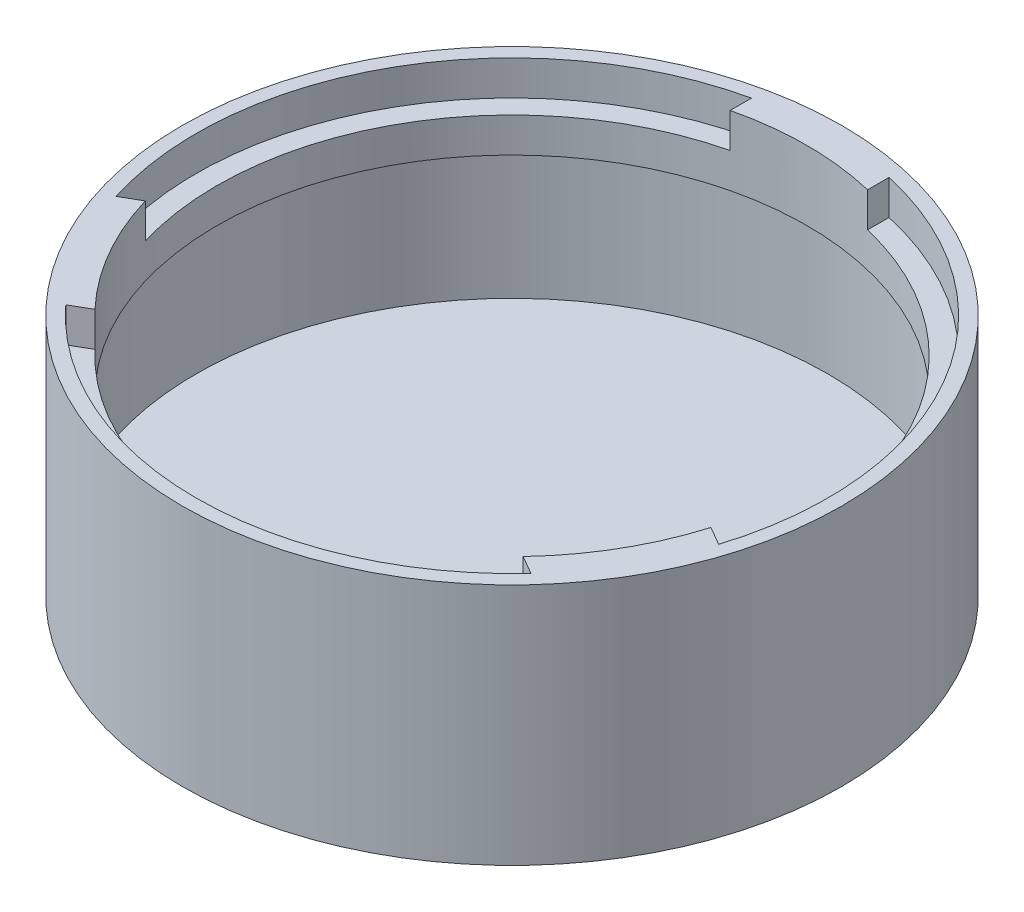
ISO-10303-21;
HEADER;
FILE_DESCRIPTION(('STEP AP214'),'2;1');
FILE_NAME('part.step','',(''),(''),'','','');
FILE_SCHEMA(('AUTOMOTIVE_DESIGN { 1 0 10303 214 1 1 1 1 }'));
ENDSEC;
DATA;
#1=APPLICATION_CONTEXT('core data for automotive mechanical design processes');
#2=APPLICATION_PROTOCOL_DEFINITION('international standard','automotive_design',2000,#1);
#3=PRODUCT_CONTEXT('',#1,'mechanical');
#4=PRODUCT('Part','Part','',(#3));
#5=PRODUCT_RELATED_PRODUCT_CATEGORY('part','',(#4));
#6=PRODUCT_DEFINITION_FORMATION('','',#4);
#7=PRODUCT_DEFINITION_CONTEXT('part definition',#1,'design');
#8=PRODUCT_DEFINITION('design','',#6,#7);
#9=PRODUCT_DEFINITION_SHAPE('','',#8);
#10=(LENGTH_UNIT() NAMED_UNIT(*) SI_UNIT(.MILLI.,.METRE.));
#11=(NAMED_UNIT(*) PLANE_ANGLE_UNIT() SI_UNIT($,.RADIAN.));
#12=(NAMED_UNIT(*) SI_UNIT($,.STERADIAN.) SOLID_ANGLE_UNIT());
#13=UNCERTAINTY_MEASURE_WITH_UNIT(LENGTH_MEASURE(1.E-05),#10,'distance_accuracy_value','');
#14=(GEOMETRIC_REPRESENTATION_CONTEXT(3) GLOBAL_UNCERTAINTY_ASSIGNED_CONTEXT((#13)) GLOBAL_UNIT_ASSIGNED_CONTEXT((#10,
#11,#12)) REPRESENTATION_CONTEXT('',''));
#15=CARTESIAN_POINT('',(0.,0.,0.));
#16=DIRECTION('',(0.,0.,1.));
#17=DIRECTION('',(1.,0.,0.));
#18=AXIS2_PLACEMENT_3D('',#15,#16,#17);
#19=CARTESIAN_POINT('',(0.,70.,0.));
#20=DIRECTION('',(0.,-1.,0.));
#21=DIRECTION('',(0.,0.,-1.));
#22=AXIS2_PLACEMENT_3D('',#19,#20,#21);
#23=CYLINDRICAL_SURFACE('',#22,91.);
#24=CARTESIAN_POINT('',(0.,60.,0.));
#25=DIRECTION('',(0.,1.,0.));
#26=DIRECTION('',(0.,0.,1.));
#27=AXIS2_PLACEMENT_3D('',#24,#25,#26);
#28=CIRCLE('',#27,91.);
#29=CARTESIAN_POINT('',(86.8202184084262,60.,27.2626058092982));
#30=VERTEX_POINT('',#29);
#31=CARTESIAN_POINT('',(19.8,60.,-88.8198176084594));
#32=VERTEX_POINT('',#31);
#33=EDGE_CURVE('E170',#30,#32,#28,.T.);
#34=ORIENTED_EDGE('',*,*,#33,.F.);
#35=DIRECTION('',(0.,-1.,0.));
#36=VECTOR('',#35,1.);
#37=CARTESIAN_POINT('',(86.8202184084262,70.,27.2626058092982));
#38=LINE('',#37,#36);
#39=CARTESIAN_POINT('',(86.8202184084262,70.,27.2626058092982));
#40=VERTEX_POINT('',#39);
#41=EDGE_CURVE('E200',#40,#30,#38,.T.);
#42=ORIENTED_EDGE('',*,*,#41,.F.);
#43=CARTESIAN_POINT('',(0.,70.,0.));
#44=DIRECTION('',(0.,1.,0.));
#45=DIRECTION('',(0.,0.,1.));
#46=AXIS2_PLACEMENT_3D('',#43,#44,#45);
#47=CIRCLE('',#46,91.);
#48=CARTESIAN_POINT('',(19.8,70.,-88.8198176084594));
#49=VERTEX_POINT('',#48);
#50=EDGE_CURVE('E232',#40,#49,#47,.T.);
#51=ORIENTED_EDGE('',*,*,#50,.T.);
#52=DIRECTION('',(0.,-1.,0.));
#53=VECTOR('',#52,1.);
#54=CARTESIAN_POINT('',(19.8,70.,-88.8198176084594));
#55=LINE('',#54,#53);
#56=EDGE_CURVE('E67',#49,#32,#55,.T.);
#57=ORIENTED_EDGE('',*,*,#56,.T.);
#58=EDGE_LOOP('',(#34,#42,#51,#57));
#59=FACE_BOUND('',#58,.T.);
#60=ADVANCED_FACE('F44',(#59),#23,.F.);
#61=CARTESIAN_POINT('',(-19.8,60.,-88.8198176084594));
#62=VERTEX_POINT('',#61);
#63=CARTESIAN_POINT('',(-86.8202184084262,60.,27.2626058092983));
#64=VERTEX_POINT('',#63);
#65=EDGE_CURVE('E59',#62,#64,#28,.T.);
#66=ORIENTED_EDGE('',*,*,#65,.F.);
#67=DIRECTION('',(0.,-1.,0.));
#68=VECTOR('',#67,1.);
#69=CARTESIAN_POINT('',(-19.8,70.,-88.8198176084594));
#70=LINE('',#69,#68);
#71=CARTESIAN_POINT('',(-19.8,70.,-88.8198176084594));
#72=VERTEX_POINT('',#71);
#73=EDGE_CURVE('E141',#72,#62,#70,.T.);
#74=ORIENTED_EDGE('',*,*,#73,.F.);
#75=CARTESIAN_POINT('',(-86.8202184084262,70.,27.2626058092983));
#76=VERTEX_POINT('',#75);
#77=EDGE_CURVE('E227',#72,#76,#47,.T.);
#78=ORIENTED_EDGE('',*,*,#77,.T.);
#79=DIRECTION('',(0.,-1.,0.));
#80=VECTOR('',#79,1.);
#81=CARTESIAN_POINT('',(-86.8202184084262,70.,27.2626058092983));
#82=LINE('',#81,#80);
#83=EDGE_CURVE('E225',#76,#64,#82,.T.);
#84=ORIENTED_EDGE('',*,*,#83,.T.);
#85=EDGE_LOOP('',(#66,#74,#78,#84));
#86=FACE_BOUND('',#85,.T.);
#87=ADVANCED_FACE('F252',(#86),#23,.F.);
#88=CARTESIAN_POINT('',(-67.020218408426,60.,61.557211799162));
#89=VERTEX_POINT('',#88);
#90=CARTESIAN_POINT('',(67.020218408426,60.,61.5572117991619));
#91=VERTEX_POINT('',#90);
#92=EDGE_CURVE('E171',#89,#91,#28,.T.);
#93=ORIENTED_EDGE('',*,*,#92,.F.);
#94=DIRECTION('',(0.,-1.,0.));
#95=VECTOR('',#94,1.);
#96=CARTESIAN_POINT('',(-67.020218408426,70.,61.557211799162));
#97=LINE('',#96,#95);
#98=CARTESIAN_POINT('',(-67.020218408426,70.,61.557211799162));
#99=VERTEX_POINT('',#98);
#100=EDGE_CURVE('E222',#99,#89,#97,.T.);
#101=ORIENTED_EDGE('',*,*,#100,.F.);
#102=CARTESIAN_POINT('',(67.020218408426,70.,61.5572117991619));
#103=VERTEX_POINT('',#102);
#104=EDGE_CURVE('E228',#99,#103,#47,.T.);
#105=ORIENTED_EDGE('',*,*,#104,.T.);
#106=DIRECTION('',(0.,-1.,0.));
#107=VECTOR('',#106,1.);
#108=CARTESIAN_POINT('',(67.020218408426,70.,61.5572117991619));
#109=LINE('',#108,#107);
#110=EDGE_CURVE('E203',#103,#91,#109,.T.);
#111=ORIENTED_EDGE('',*,*,#110,.T.);
#112=EDGE_LOOP('',(#93,#101,#105,#111));
#113=FACE_BOUND('',#112,.T.);
#114=ADVANCED_FACE('F249',(#113),#23,.F.);
#115=CARTESIAN_POINT('',(0.,10.,0.));
#116=DIRECTION('',(0.,-1.,0.));
#117=DIRECTION('',(0.,0.,-1.));
#118=AXIS2_PLACEMENT_3D('',#115,#116,#117);
#119=CYLINDRICAL_SURFACE('',#118,95.);
#120=CARTESIAN_POINT('',(0.,0.,0.));
#121=DIRECTION('',(0.,1.,0.));
#122=DIRECTION('',(0.,0.,1.));
#123=AXIS2_PLACEMENT_3D('',#120,#121,#122);
#124=CIRCLE('',#123,95.);
#125=CARTESIAN_POINT('',(0.,0.,95.));
#126=VERTEX_POINT('',#125);
#127=EDGE_CURVE('E52',#126,#126,#124,.T.);
#128=ORIENTED_EDGE('',*,*,#127,.T.);
#129=EDGE_LOOP('',(#128));
#130=FACE_BOUND('',#129,.T.);
#131=CARTESIAN_POINT('',(0.,70.,0.));
#132=DIRECTION('',(0.,1.,0.));
#133=DIRECTION('',(0.,0.,1.));
#134=AXIS2_PLACEMENT_3D('',#131,#132,#133);
#135=CIRCLE('',#134,95.);
#136=CARTESIAN_POINT('',(0.,70.,95.));
#137=VERTEX_POINT('',#136);
#138=EDGE_CURVE('E231',#137,#137,#135,.T.);
#139=ORIENTED_EDGE('',*,*,#138,.F.);
#140=EDGE_LOOP('',(#139));
#141=FACE_BOUND('',#140,.T.);
#142=ADVANCED_FACE('F46',(#130,#141),#119,.T.);
#143=CARTESIAN_POINT('',(0.,0.,0.));
#144=DIRECTION('',(0.,1.,0.));
#145=DIRECTION('',(0.,0.,1.));
#146=AXIS2_PLACEMENT_3D('',#143,#144,#145);
#147=PLANE('',#146);
#148=ORIENTED_EDGE('',*,*,#127,.F.);
#149=EDGE_LOOP('',(#148));
#150=FACE_BOUND('',#149,.T.);
#151=ADVANCED_FACE('F239',(#150),#147,.F.);
#152=CARTESIAN_POINT('',(0.,70.,0.));
#153=DIRECTION('',(0.,1.,0.));
#154=DIRECTION('',(0.,0.,1.));
#155=AXIS2_PLACEMENT_3D('',#152,#153,#154);
#156=PLANE('',#155);
#157=ORIENTED_EDGE('',*,*,#138,.T.);
#158=EDGE_LOOP('',(#157));
#159=FACE_BOUND('',#158,.T.);
#160=ORIENTED_EDGE('',*,*,#104,.F.);
#161=DIRECTION('',(0.866025403784436,0.,-0.500000000000005));
#162=VECTOR('',#161,1.);
#163=CARTESIAN_POINT('',(9.90000000000007,70.,17.1473029949318));
#164=LINE('',#163,#162);
#165=CARTESIAN_POINT('',(-61.6871496848419,70.,58.4781631359939));
#166=VERTEX_POINT('',#165);
#167=EDGE_CURVE('E209',#99,#166,#164,.T.);
#168=ORIENTED_EDGE('',*,*,#167,.T.);
#169=CARTESIAN_POINT('',(0.,70.,0.));
#170=DIRECTION('',(0.,1.,0.));
#171=DIRECTION('',(0.,0.,1.));
#172=AXIS2_PLACEMENT_3D('',#169,#170,#171);
#173=CIRCLE('',#172,85.);
#174=CARTESIAN_POINT('',(-81.4871496848421,70.,24.1835571461302));
#175=VERTEX_POINT('',#174);
#176=EDGE_CURVE('E212',#175,#166,#173,.T.);
#177=ORIENTED_EDGE('',*,*,#176,.F.);
#178=DIRECTION('',(0.866025403784436,0.,-0.500000000000004));
#179=VECTOR('',#178,1.);
#180=CARTESIAN_POINT('',(-9.90000000000007,70.,-17.1473029949318));
#181=LINE('',#180,#179);
#182=EDGE_CURVE('E206',#76,#175,#181,.T.);
#183=ORIENTED_EDGE('',*,*,#182,.F.);
#184=ORIENTED_EDGE('',*,*,#77,.F.);
#185=DIRECTION('',(0.,0.,1.));
#186=VECTOR('',#185,1.);
#187=CARTESIAN_POINT('',(-19.8,70.,0.));
#188=LINE('',#187,#186);
#189=CARTESIAN_POINT('',(-19.8,70.,-82.6617202821233));
#190=VERTEX_POINT('',#189);
#191=EDGE_CURVE('E176',#72,#190,#188,.T.);
#192=ORIENTED_EDGE('',*,*,#191,.T.);
#193=CARTESIAN_POINT('',(0.,70.,0.));
#194=DIRECTION('',(0.,1.,0.));
#195=DIRECTION('',(0.,0.,1.));
#196=AXIS2_PLACEMENT_3D('',#193,#194,#195);
#197=CIRCLE('',#196,85.);
#198=CARTESIAN_POINT('',(19.8,70.,-82.6617202821233));
#199=VERTEX_POINT('',#198);
#200=EDGE_CURVE('E153',#199,#190,#197,.T.);
#201=ORIENTED_EDGE('',*,*,#200,.F.);
#202=DIRECTION('',(0.,0.,1.));
#203=VECTOR('',#202,1.);
#204=CARTESIAN_POINT('',(19.8,70.,0.));
#205=LINE('',#204,#203);
#206=EDGE_CURVE('E144',#49,#199,#205,.T.);
#207=ORIENTED_EDGE('',*,*,#206,.F.);
#208=ORIENTED_EDGE('',*,*,#50,.F.);
#209=DIRECTION('',(0.866025403784436,0.,0.500000000000005));
#210=VECTOR('',#209,1.);
#211=CARTESIAN_POINT('',(9.90000000000011,70.,-17.1473029949319));
#212=LINE('',#211,#210);
#213=CARTESIAN_POINT('',(81.4871496848421,70.,24.1835571461302));
#214=VERTEX_POINT('',#213);
#215=EDGE_CURVE('E187',#214,#40,#212,.T.);
#216=ORIENTED_EDGE('',*,*,#215,.F.);
#217=CARTESIAN_POINT('',(0.,70.,0.));
#218=DIRECTION('',(0.,1.,0.));
#219=DIRECTION('',(0.,0.,1.));
#220=AXIS2_PLACEMENT_3D('',#217,#218,#219);
#221=CIRCLE('',#220,85.);
#222=CARTESIAN_POINT('',(61.6871496848419,70.,58.4781631359939));
#223=VERTEX_POINT('',#222);
#224=EDGE_CURVE('E190',#223,#214,#221,.T.);
#225=ORIENTED_EDGE('',*,*,#224,.F.);
#226=DIRECTION('',(0.866025403784436,0.,0.500000000000004));
#227=VECTOR('',#226,1.);
#228=CARTESIAN_POINT('',(-9.90000000000009,70.,17.1473029949319));
#229=LINE('',#228,#227);
#230=EDGE_CURVE('E185',#223,#103,#229,.T.);
#231=ORIENTED_EDGE('',*,*,#230,.T.);
#232=EDGE_LOOP('',(#160,#168,#177,#183,#184,#192,#201,#207,#208,#216,#225,#231));
#233=FACE_BOUND('',#232,.T.);
#234=ADVANCED_FACE('F241',(#159,#233),#156,.T.);
#235=CARTESIAN_POINT('',(-9.90000000000007,70.,-17.1473029949318));
#236=DIRECTION('',(-0.500000000000004,0.,-0.866025403784436));
#237=DIRECTION('',(-0.866025403784436,0.,0.500000000000004));
#238=AXIS2_PLACEMENT_3D('',#235,#236,#237);
#239=PLANE('',#238);
#240=DIRECTION('',(0.866025403784436,0.,-0.500000000000004));
#241=VECTOR('',#240,1.);
#242=CARTESIAN_POINT('',(-9.90000000000007,60.,-17.1473029949318));
#243=LINE('',#242,#241);
#244=CARTESIAN_POINT('',(-81.4871496848421,60.,24.1835571461302));
#245=VERTEX_POINT('',#244);
#246=EDGE_CURVE('E158',#64,#245,#243,.T.);
#247=ORIENTED_EDGE('',*,*,#246,.F.);
#248=ORIENTED_EDGE('',*,*,#83,.F.);
#249=ORIENTED_EDGE('',*,*,#182,.T.);
#250=DIRECTION('',(0.,-1.,0.));
#251=VECTOR('',#250,1.);
#252=CARTESIAN_POINT('',(-81.4871496848421,70.,24.1835571461302));
#253=LINE('',#252,#251);
#254=EDGE_CURVE('E215',#175,#245,#253,.T.);
#255=ORIENTED_EDGE('',*,*,#254,.T.);
#256=EDGE_LOOP('',(#247,#248,#249,#255));
#257=FACE_BOUND('',#256,.T.);
#258=ADVANCED_FACE('F246',(#257),#239,.T.);
#259=CARTESIAN_POINT('',(9.90000000000007,70.,17.1473029949318));
#260=DIRECTION('',(-0.500000000000005,0.,-0.866025403784436));
#261=DIRECTION('',(-0.866025403784436,0.,0.500000000000005));
#262=AXIS2_PLACEMENT_3D('',#259,#260,#261);
#263=PLANE('',#262);
#264=DIRECTION('',(0.866025403784436,0.,-0.500000000000005));
#265=VECTOR('',#264,1.);
#266=CARTESIAN_POINT('',(9.90000000000007,60.,17.1473029949318));
#267=LINE('',#266,#265);
#268=CARTESIAN_POINT('',(-61.6871496848419,60.,58.4781631359939));
#269=VERTEX_POINT('',#268);
#270=EDGE_CURVE('E210',#89,#269,#267,.T.);
#271=ORIENTED_EDGE('',*,*,#270,.T.);
#272=DIRECTION('',(0.,-1.,0.));
#273=VECTOR('',#272,1.);
#274=CARTESIAN_POINT('',(-61.6871496848419,70.,58.4781631359939));
#275=LINE('',#274,#273);
#276=EDGE_CURVE('E220',#166,#269,#275,.T.);
#277=ORIENTED_EDGE('',*,*,#276,.F.);
#278=ORIENTED_EDGE('',*,*,#167,.F.);
#279=ORIENTED_EDGE('',*,*,#100,.T.);
#280=EDGE_LOOP('',(#271,#277,#278,#279));
#281=FACE_BOUND('',#280,.T.);
#282=ADVANCED_FACE('F279',(#281),#263,.F.);
#283=CARTESIAN_POINT('',(0.,70.,0.));
#284=DIRECTION('',(0.,-1.,0.));
#285=DIRECTION('',(0.,0.,-1.));
#286=AXIS2_PLACEMENT_3D('',#283,#284,#285);
#287=CYLINDRICAL_SURFACE('',#286,85.);
#288=ORIENTED_EDGE('',*,*,#276,.T.);
#289=CARTESIAN_POINT('',(0.,60.,0.));
#290=DIRECTION('',(0.,1.,0.));
#291=DIRECTION('',(0.,0.,1.));
#292=AXIS2_PLACEMENT_3D('',#289,#290,#291);
#293=CIRCLE('',#292,85.);
#294=CARTESIAN_POINT('',(61.6871496848419,60.,58.4781631359939));
#295=VERTEX_POINT('',#294);
#296=EDGE_CURVE('E160',#269,#295,#293,.T.);
#297=ORIENTED_EDGE('',*,*,#296,.T.);
#298=DIRECTION('',(0.,-1.,0.));
#299=VECTOR('',#298,1.);
#300=CARTESIAN_POINT('',(61.6871496848419,70.,58.4781631359939));
#301=LINE('',#300,#299);
#302=EDGE_CURVE('E193',#223,#295,#301,.T.);
#303=ORIENTED_EDGE('',*,*,#302,.F.);
#304=ORIENTED_EDGE('',*,*,#224,.T.);
#305=DIRECTION('',(0.,-1.,0.));
#306=VECTOR('',#305,1.);
#307=CARTESIAN_POINT('',(81.4871496848421,70.,24.1835571461302));
#308=LINE('',#307,#306);
#309=CARTESIAN_POINT('',(81.4871496848421,60.,24.1835571461302));
#310=VERTEX_POINT('',#309);
#311=EDGE_CURVE('E198',#214,#310,#308,.T.);
#312=ORIENTED_EDGE('',*,*,#311,.T.);
#313=CARTESIAN_POINT('',(19.8,60.,-82.6617202821233));
#314=VERTEX_POINT('',#313);
#315=EDGE_CURVE('E159',#310,#314,#293,.T.);
#316=ORIENTED_EDGE('',*,*,#315,.T.);
#317=DIRECTION('',(0.,-1.,0.));
#318=VECTOR('',#317,1.);
#319=CARTESIAN_POINT('',(19.8,70.,-82.6617202821233));
#320=LINE('',#319,#318);
#321=EDGE_CURVE('E154',#199,#314,#320,.T.);
#322=ORIENTED_EDGE('',*,*,#321,.F.);
#323=ORIENTED_EDGE('',*,*,#200,.T.);
#324=DIRECTION('',(0.,-1.,0.));
#325=VECTOR('',#324,1.);
#326=CARTESIAN_POINT('',(-19.8,70.,-82.6617202821233));
#327=LINE('',#326,#325);
#328=CARTESIAN_POINT('',(-19.8,60.,-82.6617202821233));
#329=VERTEX_POINT('',#328);
#330=EDGE_CURVE('E139',#190,#329,#327,.T.);
#331=ORIENTED_EDGE('',*,*,#330,.T.);
#332=EDGE_CURVE('E151',#329,#245,#293,.T.);
#333=ORIENTED_EDGE('',*,*,#332,.T.);
#334=ORIENTED_EDGE('',*,*,#254,.F.);
#335=ORIENTED_EDGE('',*,*,#176,.T.);
#336=EDGE_LOOP('',(#288,#297,#303,#304,#312,#316,#322,#323,#331,#333,#334,#335));
#337=FACE_BOUND('',#336,.T.);
#338=CARTESIAN_POINT('',(0.,50.,0.));
#339=DIRECTION('',(0.,1.,0.));
#340=DIRECTION('',(0.,0.,1.));
#341=AXIS2_PLACEMENT_3D('',#338,#339,#340);
#342=CIRCLE('',#341,85.);
#343=CARTESIAN_POINT('',(0.,50.,85.));
#344=VERTEX_POINT('',#343);
#345=EDGE_CURVE('E163',#344,#344,#342,.T.);
#346=ORIENTED_EDGE('',*,*,#345,.F.);
#347=EDGE_LOOP('',(#346));
#348=FACE_BOUND('',#347,.T.);
#349=ADVANCED_FACE('F149',(#337,#348),#287,.F.);
#350=CARTESIAN_POINT('',(-9.90000000000009,70.,17.1473029949319));
#351=DIRECTION('',(0.500000000000004,0.,-0.866025403784436));
#352=DIRECTION('',(-0.866025403784436,0.,-0.500000000000004));
#353=AXIS2_PLACEMENT_3D('',#350,#351,#352);
#354=PLANE('',#353);
#355=DIRECTION('',(0.866025403784436,0.,0.500000000000004));
#356=VECTOR('',#355,1.);
#357=CARTESIAN_POINT('',(-9.90000000000009,60.,17.1473029949319));
#358=LINE('',#357,#356);
#359=EDGE_CURVE('E184',#295,#91,#358,.T.);
#360=ORIENTED_EDGE('',*,*,#359,.T.);
#361=ORIENTED_EDGE('',*,*,#110,.F.);
#362=ORIENTED_EDGE('',*,*,#230,.F.);
#363=ORIENTED_EDGE('',*,*,#302,.T.);
#364=EDGE_LOOP('',(#360,#361,#362,#363));
#365=FACE_BOUND('',#364,.T.);
#366=ADVANCED_FACE('F290',(#365),#354,.F.);
#367=CARTESIAN_POINT('',(9.90000000000011,70.,-17.1473029949319));
#368=DIRECTION('',(0.500000000000004,0.,-0.866025403784436));
#369=DIRECTION('',(-0.866025403784436,0.,-0.500000000000004));
#370=AXIS2_PLACEMENT_3D('',#367,#368,#369);
#371=PLANE('',#370);
#372=DIRECTION('',(0.866025403784436,0.,0.500000000000005));
#373=VECTOR('',#372,1.);
#374=CARTESIAN_POINT('',(9.90000000000011,60.,-17.1473029949319));
#375=LINE('',#374,#373);
#376=EDGE_CURVE('E188',#310,#30,#375,.T.);
#377=ORIENTED_EDGE('',*,*,#376,.F.);
#378=ORIENTED_EDGE('',*,*,#311,.F.);
#379=ORIENTED_EDGE('',*,*,#215,.T.);
#380=ORIENTED_EDGE('',*,*,#41,.T.);
#381=EDGE_LOOP('',(#377,#378,#379,#380));
#382=FACE_BOUND('',#381,.T.);
#383=ADVANCED_FACE('F292',(#382),#371,.T.);
#384=CARTESIAN_POINT('',(19.8,70.,0.));
#385=DIRECTION('',(1.,0.,0.));
#386=DIRECTION('',(0.,0.,-1.));
#387=AXIS2_PLACEMENT_3D('',#384,#385,#386);
#388=PLANE('',#387);
#389=DIRECTION('',(0.,0.,1.));
#390=VECTOR('',#389,1.);
#391=CARTESIAN_POINT('',(19.8,60.,0.));
#392=LINE('',#391,#390);
#393=EDGE_CURVE('E145',#32,#314,#392,.T.);
#394=ORIENTED_EDGE('',*,*,#393,.F.);
#395=ORIENTED_EDGE('',*,*,#56,.F.);
#396=ORIENTED_EDGE('',*,*,#206,.T.);
#397=ORIENTED_EDGE('',*,*,#321,.T.);
#398=EDGE_LOOP('',(#394,#395,#396,#397));
#399=FACE_BOUND('',#398,.T.);
#400=ADVANCED_FACE('F298',(#399),#388,.T.);
#401=CARTESIAN_POINT('',(-19.8,70.,0.));
#402=DIRECTION('',(1.,0.,0.));
#403=DIRECTION('',(0.,0.,-1.));
#404=AXIS2_PLACEMENT_3D('',#401,#402,#403);
#405=PLANE('',#404);
#406=DIRECTION('',(0.,0.,1.));
#407=VECTOR('',#406,1.);
#408=CARTESIAN_POINT('',(-19.8,60.,0.));
#409=LINE('',#408,#407);
#410=EDGE_CURVE('E135',#62,#329,#409,.T.);
#411=ORIENTED_EDGE('',*,*,#410,.T.);
#412=ORIENTED_EDGE('',*,*,#330,.F.);
#413=ORIENTED_EDGE('',*,*,#191,.F.);
#414=ORIENTED_EDGE('',*,*,#73,.T.);
#415=EDGE_LOOP('',(#411,#412,#413,#414));
#416=FACE_BOUND('',#415,.T.);
#417=ADVANCED_FACE('F137',(#416),#405,.F.);
#418=CARTESIAN_POINT('',(0.,60.,0.));
#419=DIRECTION('',(0.,1.,0.));
#420=DIRECTION('',(0.,0.,1.));
#421=AXIS2_PLACEMENT_3D('',#418,#419,#420);
#422=PLANE('',#421);
#423=ORIENTED_EDGE('',*,*,#270,.F.);
#424=ORIENTED_EDGE('',*,*,#92,.T.);
#425=ORIENTED_EDGE('',*,*,#359,.F.);
#426=ORIENTED_EDGE('',*,*,#296,.F.);
#427=EDGE_LOOP('',(#423,#424,#425,#426));
#428=FACE_BOUND('',#427,.T.);
#429=ADVANCED_FACE('F282',(#428),#422,.T.);
#430=ORIENTED_EDGE('',*,*,#65,.T.);
#431=ORIENTED_EDGE('',*,*,#246,.T.);
#432=ORIENTED_EDGE('',*,*,#332,.F.);
#433=ORIENTED_EDGE('',*,*,#410,.F.);
#434=EDGE_LOOP('',(#430,#431,#432,#433));
#435=FACE_BOUND('',#434,.T.);
#436=ADVANCED_FACE('F157',(#435),#422,.T.);
#437=CARTESIAN_POINT('',(0.,50.,0.));
#438=DIRECTION('',(0.,1.,0.));
#439=DIRECTION('',(0.,0.,1.));
#440=AXIS2_PLACEMENT_3D('',#437,#438,#439);
#441=PLANE('',#440);
#442=ORIENTED_EDGE('',*,*,#345,.T.);
#443=EDGE_LOOP('',(#442));
#444=FACE_BOUND('',#443,.T.);
#445=CARTESIAN_POINT('',(0.,50.,0.));
#446=DIRECTION('',(0.,1.,0.));
#447=DIRECTION('',(0.,0.,1.));
#448=AXIS2_PLACEMENT_3D('',#445,#446,#447);
#449=CIRCLE('',#448,91.);
#450=CARTESIAN_POINT('',(0.,50.,91.));
#451=VERTEX_POINT('',#450);
#452=EDGE_CURVE('E167',#451,#451,#449,.T.);
#453=ORIENTED_EDGE('',*,*,#452,.F.);
#454=EDGE_LOOP('',(#453));
#455=FACE_BOUND('',#454,.T.);
#456=ADVANCED_FACE('F326',(#444,#455),#441,.F.);
#457=ORIENTED_EDGE('',*,*,#315,.F.);
#458=ORIENTED_EDGE('',*,*,#376,.T.);
#459=ORIENTED_EDGE('',*,*,#33,.T.);
#460=ORIENTED_EDGE('',*,*,#393,.T.);
#461=EDGE_LOOP('',(#457,#458,#459,#460));
#462=FACE_BOUND('',#461,.T.);
#463=ADVANCED_FACE('F265',(#462),#422,.T.);
#464=CARTESIAN_POINT('',(0.,10.,0.));
#465=DIRECTION('',(0.,1.,0.));
#466=DIRECTION('',(0.,0.,1.));
#467=AXIS2_PLACEMENT_3D('',#464,#465,#466);
#468=PLANE('',#467);
#469=CARTESIAN_POINT('',(0.,10.,0.));
#470=DIRECTION('',(0.,1.,0.));
#471=DIRECTION('',(0.,0.,1.));
#472=AXIS2_PLACEMENT_3D('',#469,#470,#471);
#473=CIRCLE('',#472,91.);
#474=CARTESIAN_POINT('',(0.,10.,91.));
#475=VERTEX_POINT('',#474);
#476=EDGE_CURVE('E11',#475,#475,#473,.F.);
#477=ORIENTED_EDGE('',*,*,#476,.F.);
#478=EDGE_LOOP('',(#477));
#479=FACE_BOUND('',#478,.T.);
#480=ADVANCED_FACE('F260',(#479),#468,.T.);
#481=ORIENTED_EDGE('',*,*,#476,.T.);
#482=EDGE_LOOP('',(#481));
#483=FACE_BOUND('',#482,.T.);
#484=ORIENTED_EDGE('',*,*,#452,.T.);
#485=EDGE_LOOP('',(#484));
#486=FACE_BOUND('',#485,.T.);
#487=ADVANCED_FACE('F254',(#483,#486),#23,.F.);
#488=CLOSED_SHELL('',(#60,#87,#114,#142,#151,#234,#258,#282,#349,#366,#383,#400,#417,#429,#436,
#456,#463,#480,#487));
#489=MANIFOLD_SOLID_BREP('B2',#488);
#490=ADVANCED_BREP_SHAPE_REPRESENTATION('',(#18,#489),#14);
#491=SHAPE_DEFINITION_REPRESENTATION(#9,#490);
ENDSEC;
END-ISO-10303-21;
